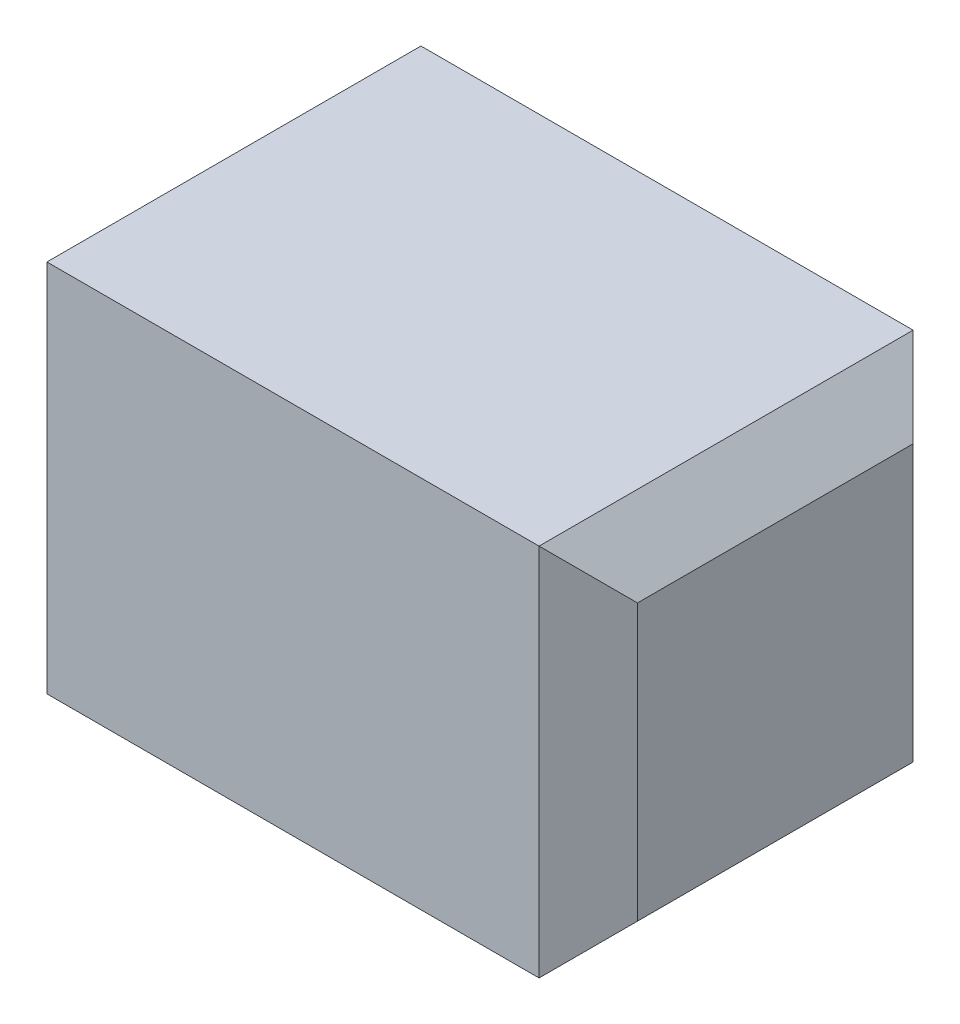
ISO-10303-21;
HEADER;
FILE_DESCRIPTION(('STEP AP214'),'2;1');
FILE_NAME('part.step','',(''),(''),'','','');
FILE_SCHEMA(('AUTOMOTIVE_DESIGN { 1 0 10303 214 1 1 1 1 }'));
ENDSEC;
DATA;
#1=APPLICATION_CONTEXT('core data for automotive mechanical design processes');
#2=APPLICATION_PROTOCOL_DEFINITION('international standard','automotive_design',2000,#1);
#3=PRODUCT_CONTEXT('',#1,'mechanical');
#4=PRODUCT('Part','Part','',(#3));
#5=PRODUCT_RELATED_PRODUCT_CATEGORY('part','',(#4));
#6=PRODUCT_DEFINITION_FORMATION('','',#4);
#7=PRODUCT_DEFINITION_CONTEXT('part definition',#1,'design');
#8=PRODUCT_DEFINITION('design','',#6,#7);
#9=PRODUCT_DEFINITION_SHAPE('','',#8);
#10=(LENGTH_UNIT() NAMED_UNIT(*) SI_UNIT(.MILLI.,.METRE.));
#11=(NAMED_UNIT(*) PLANE_ANGLE_UNIT() SI_UNIT($,.RADIAN.));
#12=(NAMED_UNIT(*) SI_UNIT($,.STERADIAN.) SOLID_ANGLE_UNIT());
#13=UNCERTAINTY_MEASURE_WITH_UNIT(LENGTH_MEASURE(1.E-05),#10,'distance_accuracy_value','');
#14=(GEOMETRIC_REPRESENTATION_CONTEXT(3) GLOBAL_UNCERTAINTY_ASSIGNED_CONTEXT((#13)) GLOBAL_UNIT_ASSIGNED_CONTEXT((#10,
#11,#12)) REPRESENTATION_CONTEXT('',''));
#15=CARTESIAN_POINT('',(0.,0.,0.));
#16=DIRECTION('',(0.,0.,1.));
#17=DIRECTION('',(1.,0.,0.));
#18=AXIS2_PLACEMENT_3D('',#15,#16,#17);
#19=CARTESIAN_POINT('',(3.,3.8,-1.9));
#20=DIRECTION('',(-1.,0.,0.));
#21=DIRECTION('',(0.,0.,1.));
#22=AXIS2_PLACEMENT_3D('',#19,#20,#21);
#23=PLANE('',#22);
#24=DIRECTION('',(0.,0.,1.));
#25=VECTOR('',#24,1.);
#26=CARTESIAN_POINT('',(3.,3.3,1.9));
#27=LINE('',#26,#25);
#28=CARTESIAN_POINT('',(3.,3.3,-1.4));
#29=VERTEX_POINT('',#28);
#30=CARTESIAN_POINT('',(3.,3.3,1.4));
#31=VERTEX_POINT('',#30);
#32=EDGE_CURVE('E52',#29,#31,#27,.T.);
#33=ORIENTED_EDGE('',*,*,#32,.T.);
#34=DIRECTION('',(0.,-1.,0.));
#35=VECTOR('',#34,1.);
#36=CARTESIAN_POINT('',(3.,3.8,1.4));
#37=LINE('',#36,#35);
#38=CARTESIAN_POINT('',(3.,0.5,1.4));
#39=VERTEX_POINT('',#38);
#40=EDGE_CURVE('E11',#31,#39,#37,.T.);
#41=ORIENTED_EDGE('',*,*,#40,.T.);
#42=DIRECTION('',(0.,0.,-1.));
#43=VECTOR('',#42,1.);
#44=CARTESIAN_POINT('',(3.,0.5,-1.9));
#45=LINE('',#44,#43);
#46=CARTESIAN_POINT('',(3.,0.5,-1.4));
#47=VERTEX_POINT('',#46);
#48=EDGE_CURVE('E166',#39,#47,#45,.T.);
#49=ORIENTED_EDGE('',*,*,#48,.T.);
#50=DIRECTION('',(0.,1.,0.));
#51=VECTOR('',#50,1.);
#52=CARTESIAN_POINT('',(3.,3.8,-1.4));
#53=LINE('',#52,#51);
#54=EDGE_CURVE('E63',#47,#29,#53,.T.);
#55=ORIENTED_EDGE('',*,*,#54,.T.);
#56=EDGE_LOOP('',(#33,#41,#49,#55));
#57=FACE_BOUND('',#56,.T.);
#58=ADVANCED_FACE('F41',(#57),#23,.F.);
#59=CARTESIAN_POINT('',(-3.,3.8,-1.9));
#60=DIRECTION('',(0.,0.,1.));
#61=DIRECTION('',(1.,0.,0.));
#62=AXIS2_PLACEMENT_3D('',#59,#60,#61);
#63=PLANE('',#62);
#64=DIRECTION('',(-1.,0.,0.));
#65=VECTOR('',#64,1.);
#66=CARTESIAN_POINT('',(-3.,0.,-1.9));
#67=LINE('',#66,#65);
#68=CARTESIAN_POINT('',(2.5,0.,-1.9));
#69=VERTEX_POINT('',#68);
#70=CARTESIAN_POINT('',(-2.5,0.,-1.9));
#71=VERTEX_POINT('',#70);
#72=EDGE_CURVE('E181',#69,#71,#67,.T.);
#73=ORIENTED_EDGE('',*,*,#72,.T.);
#74=DIRECTION('',(0.,1.,0.));
#75=VECTOR('',#74,1.);
#76=CARTESIAN_POINT('',(-2.5,3.8,-1.9));
#77=LINE('',#76,#75);
#78=CARTESIAN_POINT('',(-2.5,3.8,-1.9));
#79=VERTEX_POINT('',#78);
#80=EDGE_CURVE('E115',#71,#79,#77,.T.);
#81=ORIENTED_EDGE('',*,*,#80,.T.);
#82=DIRECTION('',(-1.,0.,0.));
#83=VECTOR('',#82,1.);
#84=CARTESIAN_POINT('',(-3.,3.8,-1.9));
#85=LINE('',#84,#83);
#86=CARTESIAN_POINT('',(2.5,3.8,-1.9));
#87=VERTEX_POINT('',#86);
#88=EDGE_CURVE('E207',#87,#79,#85,.T.);
#89=ORIENTED_EDGE('',*,*,#88,.F.);
#90=DIRECTION('',(0.,-1.,0.));
#91=VECTOR('',#90,1.);
#92=CARTESIAN_POINT('',(2.5,3.8,-1.9));
#93=LINE('',#92,#91);
#94=EDGE_CURVE('E137',#87,#69,#93,.T.);
#95=ORIENTED_EDGE('',*,*,#94,.T.);
#96=EDGE_LOOP('',(#73,#81,#89,#95));
#97=FACE_BOUND('',#96,.T.);
#98=ADVANCED_FACE('F205',(#97),#63,.F.);
#99=CARTESIAN_POINT('',(-3.,3.8,-1.9));
#100=DIRECTION('',(1.,0.,0.));
#101=DIRECTION('',(0.,0.,-1.));
#102=AXIS2_PLACEMENT_3D('',#99,#100,#101);
#103=PLANE('',#102);
#104=DIRECTION('',(0.,0.,-1.));
#105=VECTOR('',#104,1.);
#106=CARTESIAN_POINT('',(-3.,3.3,-1.9));
#107=LINE('',#106,#105);
#108=CARTESIAN_POINT('',(-3.,3.3,1.4));
#109=VERTEX_POINT('',#108);
#110=CARTESIAN_POINT('',(-3.,3.3,-1.4));
#111=VERTEX_POINT('',#110);
#112=EDGE_CURVE('E134',#109,#111,#107,.T.);
#113=ORIENTED_EDGE('',*,*,#112,.T.);
#114=DIRECTION('',(0.,-1.,0.));
#115=VECTOR('',#114,1.);
#116=CARTESIAN_POINT('',(-3.,3.8,-1.4));
#117=LINE('',#116,#115);
#118=CARTESIAN_POINT('',(-3.,0.5,-1.4));
#119=VERTEX_POINT('',#118);
#120=EDGE_CURVE('E113',#111,#119,#117,.T.);
#121=ORIENTED_EDGE('',*,*,#120,.T.);
#122=DIRECTION('',(0.,0.,1.));
#123=VECTOR('',#122,1.);
#124=CARTESIAN_POINT('',(-3.,0.5,-1.9));
#125=LINE('',#124,#123);
#126=CARTESIAN_POINT('',(-3.,0.5,1.4));
#127=VERTEX_POINT('',#126);
#128=EDGE_CURVE('E122',#119,#127,#125,.T.);
#129=ORIENTED_EDGE('',*,*,#128,.T.);
#130=DIRECTION('',(0.,1.,0.));
#131=VECTOR('',#130,1.);
#132=CARTESIAN_POINT('',(-3.,3.8,1.4));
#133=LINE('',#132,#131);
#134=EDGE_CURVE('E129',#127,#109,#133,.T.);
#135=ORIENTED_EDGE('',*,*,#134,.T.);
#136=EDGE_LOOP('',(#113,#121,#129,#135));
#137=FACE_BOUND('',#136,.T.);
#138=ADVANCED_FACE('F132',(#137),#103,.F.);
#139=CARTESIAN_POINT('',(-3.,3.8,1.9));
#140=DIRECTION('',(0.,0.,-1.));
#141=DIRECTION('',(-1.,0.,0.));
#142=AXIS2_PLACEMENT_3D('',#139,#140,#141);
#143=PLANE('',#142);
#144=DIRECTION('',(1.,0.,0.));
#145=VECTOR('',#144,1.);
#146=CARTESIAN_POINT('',(-3.,3.8,1.9));
#147=LINE('',#146,#145);
#148=CARTESIAN_POINT('',(-2.5,3.8,1.9));
#149=VERTEX_POINT('',#148);
#150=CARTESIAN_POINT('',(2.5,3.8,1.9));
#151=VERTEX_POINT('',#150);
#152=EDGE_CURVE('E130',#149,#151,#147,.T.);
#153=ORIENTED_EDGE('',*,*,#152,.F.);
#154=DIRECTION('',(0.,-1.,0.));
#155=VECTOR('',#154,1.);
#156=CARTESIAN_POINT('',(-2.5,3.8,1.9));
#157=LINE('',#156,#155);
#158=CARTESIAN_POINT('',(-2.5,0.,1.9));
#159=VERTEX_POINT('',#158);
#160=EDGE_CURVE('E157',#149,#159,#157,.T.);
#161=ORIENTED_EDGE('',*,*,#160,.T.);
#162=DIRECTION('',(1.,0.,0.));
#163=VECTOR('',#162,1.);
#164=CARTESIAN_POINT('',(-3.,0.,1.9));
#165=LINE('',#164,#163);
#166=CARTESIAN_POINT('',(2.5,0.,1.9));
#167=VERTEX_POINT('',#166);
#168=EDGE_CURVE('E213',#159,#167,#165,.T.);
#169=ORIENTED_EDGE('',*,*,#168,.T.);
#170=DIRECTION('',(0.,1.,0.));
#171=VECTOR('',#170,1.);
#172=CARTESIAN_POINT('',(2.5,3.8,1.9));
#173=LINE('',#172,#171);
#174=EDGE_CURVE('E153',#167,#151,#173,.T.);
#175=ORIENTED_EDGE('',*,*,#174,.T.);
#176=EDGE_LOOP('',(#153,#161,#169,#175));
#177=FACE_BOUND('',#176,.T.);
#178=ADVANCED_FACE('F234',(#177),#143,.F.);
#179=CARTESIAN_POINT('',(0.,3.8,0.));
#180=DIRECTION('',(0.,1.,0.));
#181=DIRECTION('',(0.,0.,1.));
#182=AXIS2_PLACEMENT_3D('',#179,#180,#181);
#183=PLANE('',#182);
#184=ORIENTED_EDGE('',*,*,#88,.T.);
#185=DIRECTION('',(0.,0.,1.));
#186=VECTOR('',#185,1.);
#187=CARTESIAN_POINT('',(-2.5,3.8,1.9));
#188=LINE('',#187,#186);
#189=EDGE_CURVE('E150',#79,#149,#188,.T.);
#190=ORIENTED_EDGE('',*,*,#189,.T.);
#191=ORIENTED_EDGE('',*,*,#152,.T.);
#192=DIRECTION('',(0.,0.,-1.));
#193=VECTOR('',#192,1.);
#194=CARTESIAN_POINT('',(2.5,3.8,-1.9));
#195=LINE('',#194,#193);
#196=EDGE_CURVE('E147',#151,#87,#195,.T.);
#197=ORIENTED_EDGE('',*,*,#196,.T.);
#198=EDGE_LOOP('',(#184,#190,#191,#197));
#199=FACE_BOUND('',#198,.T.);
#200=ADVANCED_FACE('F230',(#199),#183,.T.);
#201=CARTESIAN_POINT('',(0.,0.,0.));
#202=DIRECTION('',(0.,1.,0.));
#203=DIRECTION('',(0.,0.,1.));
#204=AXIS2_PLACEMENT_3D('',#201,#202,#203);
#205=PLANE('',#204);
#206=ORIENTED_EDGE('',*,*,#168,.F.);
#207=DIRECTION('',(0.,0.,-1.));
#208=VECTOR('',#207,1.);
#209=CARTESIAN_POINT('',(-2.5,0.,0.));
#210=LINE('',#209,#208);
#211=EDGE_CURVE('E163',#159,#71,#210,.T.);
#212=ORIENTED_EDGE('',*,*,#211,.T.);
#213=ORIENTED_EDGE('',*,*,#72,.F.);
#214=DIRECTION('',(0.,0.,1.));
#215=VECTOR('',#214,1.);
#216=CARTESIAN_POINT('',(2.5,0.,0.));
#217=LINE('',#216,#215);
#218=EDGE_CURVE('E160',#69,#167,#217,.T.);
#219=ORIENTED_EDGE('',*,*,#218,.T.);
#220=EDGE_LOOP('',(#206,#212,#213,#219));
#221=FACE_BOUND('',#220,.T.);
#222=ADVANCED_FACE('F210',(#221),#205,.F.);
#223=CARTESIAN_POINT('',(-2.5,3.8,1.9));
#224=DIRECTION('',(0.707106781186545,0.,-0.70710678118655));
#225=DIRECTION('',(0.,-1.,0.));
#226=AXIS2_PLACEMENT_3D('',#223,#224,#225);
#227=PLANE('',#226);
#228=DIRECTION('',(-0.577350269189628,0.577350269189625,-0.577350269189625));
#229=VECTOR('',#228,1.);
#230=CARTESIAN_POINT('',(-4.1,1.6,0.300000000000006));
#231=LINE('',#230,#229);
#232=EDGE_CURVE('E125',#159,#127,#231,.T.);
#233=ORIENTED_EDGE('',*,*,#232,.F.);
#234=ORIENTED_EDGE('',*,*,#160,.F.);
#235=DIRECTION('',(0.577350269189628,0.577350269189625,0.577350269189625));
#236=VECTOR('',#235,1.);
#237=CARTESIAN_POINT('',(-2.5,3.8,1.9));
#238=LINE('',#237,#236);
#239=EDGE_CURVE('E177',#109,#149,#238,.T.);
#240=ORIENTED_EDGE('',*,*,#239,.F.);
#241=ORIENTED_EDGE('',*,*,#134,.F.);
#242=EDGE_LOOP('',(#233,#234,#240,#241));
#243=FACE_BOUND('',#242,.T.);
#244=ADVANCED_FACE('F223',(#243),#227,.F.);
#245=CARTESIAN_POINT('',(-2.5,3.8,0.));
#246=DIRECTION('',(-0.707106781186546,0.707106781186549,0.));
#247=DIRECTION('',(0.,0.,-1.));
#248=AXIS2_PLACEMENT_3D('',#245,#246,#247);
#249=PLANE('',#248);
#250=ORIENTED_EDGE('',*,*,#239,.T.);
#251=ORIENTED_EDGE('',*,*,#189,.F.);
#252=DIRECTION('',(0.577350269189628,0.577350269189625,-0.577350269189625));
#253=VECTOR('',#252,1.);
#254=CARTESIAN_POINT('',(-3.13333333333333,3.16666666666667,-1.26666666666667));
#255=LINE('',#254,#253);
#256=EDGE_CURVE('E119',#111,#79,#255,.T.);
#257=ORIENTED_EDGE('',*,*,#256,.F.);
#258=ORIENTED_EDGE('',*,*,#112,.F.);
#259=EDGE_LOOP('',(#250,#251,#257,#258));
#260=FACE_BOUND('',#259,.T.);
#261=ADVANCED_FACE('F226',(#260),#249,.T.);
#262=CARTESIAN_POINT('',(-3.,0.5,-1.9));
#263=DIRECTION('',(0.707106781186546,0.707106781186549,0.));
#264=DIRECTION('',(0.,0.,1.));
#265=AXIS2_PLACEMENT_3D('',#262,#263,#264);
#266=PLANE('',#265);
#267=ORIENTED_EDGE('',*,*,#232,.T.);
#268=ORIENTED_EDGE('',*,*,#128,.F.);
#269=DIRECTION('',(0.577350269189628,-0.577350269189625,-0.577350269189625));
#270=VECTOR('',#269,1.);
#271=CARTESIAN_POINT('',(-2.83333333333333,0.333333333333334,-1.56666666666667));
#272=LINE('',#271,#270);
#273=EDGE_CURVE('E109',#71,#119,#272,.F.);
#274=ORIENTED_EDGE('',*,*,#273,.F.);
#275=ORIENTED_EDGE('',*,*,#211,.F.);
#276=EDGE_LOOP('',(#267,#268,#274,#275));
#277=FACE_BOUND('',#276,.T.);
#278=ADVANCED_FACE('F123',(#277),#266,.F.);
#279=CARTESIAN_POINT('',(-3.,3.8,-1.4));
#280=DIRECTION('',(0.707106781186545,0.,0.707106781186549));
#281=DIRECTION('',(0.,-1.,0.));
#282=AXIS2_PLACEMENT_3D('',#279,#280,#281);
#283=PLANE('',#282);
#284=ORIENTED_EDGE('',*,*,#256,.T.);
#285=ORIENTED_EDGE('',*,*,#80,.F.);
#286=ORIENTED_EDGE('',*,*,#273,.T.);
#287=ORIENTED_EDGE('',*,*,#120,.F.);
#288=EDGE_LOOP('',(#284,#285,#286,#287));
#289=FACE_BOUND('',#288,.T.);
#290=ADVANCED_FACE('F111',(#289),#283,.F.);
#291=CARTESIAN_POINT('',(2.5,3.8,-1.9));
#292=DIRECTION('',(-0.707106781186545,0.,0.707106781186549));
#293=DIRECTION('',(0.,-1.,0.));
#294=AXIS2_PLACEMENT_3D('',#291,#292,#293);
#295=PLANE('',#294);
#296=DIRECTION('',(0.577350269189628,0.577350269189625,0.577350269189625));
#297=VECTOR('',#296,1.);
#298=CARTESIAN_POINT('',(2.83333333333333,0.333333333333334,-1.56666666666667));
#299=LINE('',#298,#297);
#300=EDGE_CURVE('E187',#69,#47,#299,.T.);
#301=ORIENTED_EDGE('',*,*,#300,.F.);
#302=ORIENTED_EDGE('',*,*,#94,.F.);
#303=DIRECTION('',(-0.577350269189628,0.577350269189625,-0.577350269189625));
#304=VECTOR('',#303,1.);
#305=CARTESIAN_POINT('',(2.5,3.8,-1.9));
#306=LINE('',#305,#304);
#307=EDGE_CURVE('E46',#29,#87,#306,.T.);
#308=ORIENTED_EDGE('',*,*,#307,.F.);
#309=ORIENTED_EDGE('',*,*,#54,.F.);
#310=EDGE_LOOP('',(#301,#302,#308,#309));
#311=FACE_BOUND('',#310,.T.);
#312=ADVANCED_FACE('F44',(#311),#295,.F.);
#313=CARTESIAN_POINT('',(2.5,3.8,0.));
#314=DIRECTION('',(0.707106781186546,0.707106781186549,0.));
#315=DIRECTION('',(0.,0.,1.));
#316=AXIS2_PLACEMENT_3D('',#313,#314,#315);
#317=PLANE('',#316);
#318=ORIENTED_EDGE('',*,*,#307,.T.);
#319=ORIENTED_EDGE('',*,*,#196,.F.);
#320=DIRECTION('',(-0.577350269189628,0.577350269189625,0.577350269189625));
#321=VECTOR('',#320,1.);
#322=CARTESIAN_POINT('',(3.13333333333333,3.16666666666667,1.26666666666667));
#323=LINE('',#322,#321);
#324=EDGE_CURVE('E185',#31,#151,#323,.T.);
#325=ORIENTED_EDGE('',*,*,#324,.F.);
#326=ORIENTED_EDGE('',*,*,#32,.F.);
#327=EDGE_LOOP('',(#318,#319,#325,#326));
#328=FACE_BOUND('',#327,.T.);
#329=ADVANCED_FACE('F198',(#328),#317,.T.);
#330=CARTESIAN_POINT('',(3.,0.5,-1.9));
#331=DIRECTION('',(-0.707106781186546,0.707106781186549,0.));
#332=DIRECTION('',(0.,0.,-1.));
#333=AXIS2_PLACEMENT_3D('',#330,#331,#332);
#334=PLANE('',#333);
#335=ORIENTED_EDGE('',*,*,#300,.T.);
#336=ORIENTED_EDGE('',*,*,#48,.F.);
#337=DIRECTION('',(-0.577350269189628,-0.577350269189625,0.577350269189625));
#338=VECTOR('',#337,1.);
#339=CARTESIAN_POINT('',(4.1,1.6,0.300000000000006));
#340=LINE('',#339,#338);
#341=EDGE_CURVE('E182',#167,#39,#340,.F.);
#342=ORIENTED_EDGE('',*,*,#341,.F.);
#343=ORIENTED_EDGE('',*,*,#218,.F.);
#344=EDGE_LOOP('',(#335,#336,#342,#343));
#345=FACE_BOUND('',#344,.T.);
#346=ADVANCED_FACE('F240',(#345),#334,.F.);
#347=CARTESIAN_POINT('',(3.,3.8,1.4));
#348=DIRECTION('',(-0.707106781186545,0.,-0.70710678118655));
#349=DIRECTION('',(0.,-1.,0.));
#350=AXIS2_PLACEMENT_3D('',#347,#348,#349);
#351=PLANE('',#350);
#352=ORIENTED_EDGE('',*,*,#324,.T.);
#353=ORIENTED_EDGE('',*,*,#174,.F.);
#354=ORIENTED_EDGE('',*,*,#341,.T.);
#355=ORIENTED_EDGE('',*,*,#40,.F.);
#356=EDGE_LOOP('',(#352,#353,#354,#355));
#357=FACE_BOUND('',#356,.T.);
#358=ADVANCED_FACE('F238',(#357),#351,.F.);
#359=CLOSED_SHELL('',(#58,#98,#138,#178,#200,#222,#244,#261,#278,#290,#312,#329,#346,#358));
#360=MANIFOLD_SOLID_BREP('B2',#359);
#361=ADVANCED_BREP_SHAPE_REPRESENTATION('',(#18,#360),#14);
#362=SHAPE_DEFINITION_REPRESENTATION(#9,#361);
ENDSEC;
END-ISO-10303-21;
